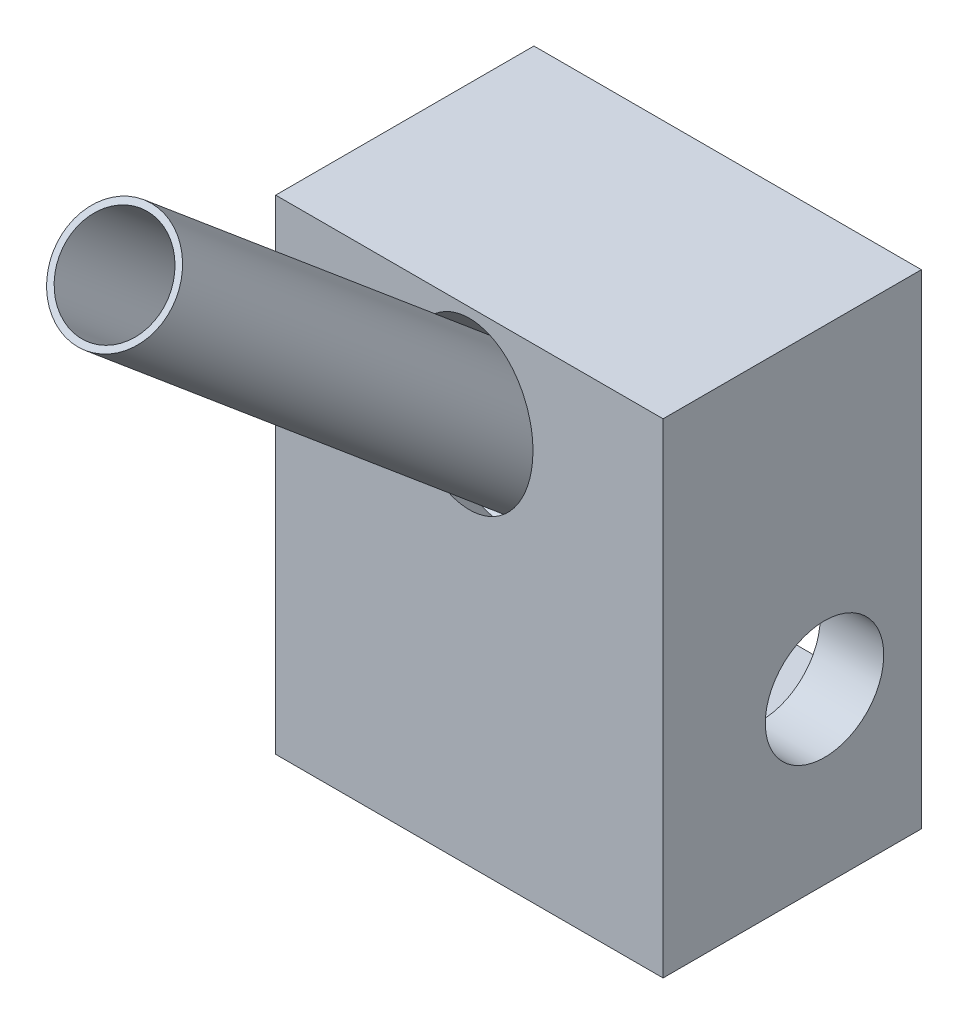
ISO-10303-21;
HEADER;
FILE_DESCRIPTION(('STEP AP214'),'2;1');
FILE_NAME('part.step','',(''),(''),'','','');
FILE_SCHEMA(('AUTOMOTIVE_DESIGN { 1 0 10303 214 1 1 1 1 }'));
ENDSEC;
DATA;
#1=APPLICATION_CONTEXT('core data for automotive mechanical design processes');
#2=APPLICATION_PROTOCOL_DEFINITION('international standard','automotive_design',2000,#1);
#3=PRODUCT_CONTEXT('',#1,'mechanical');
#4=PRODUCT('Part','Part','',(#3));
#5=PRODUCT_RELATED_PRODUCT_CATEGORY('part','',(#4));
#6=PRODUCT_DEFINITION_FORMATION('','',#4);
#7=PRODUCT_DEFINITION_CONTEXT('part definition',#1,'design');
#8=PRODUCT_DEFINITION('design','',#6,#7);
#9=PRODUCT_DEFINITION_SHAPE('','',#8);
#10=(LENGTH_UNIT() NAMED_UNIT(*) SI_UNIT(.MILLI.,.METRE.));
#11=(NAMED_UNIT(*) PLANE_ANGLE_UNIT() SI_UNIT($,.RADIAN.));
#12=(NAMED_UNIT(*) SI_UNIT($,.STERADIAN.) SOLID_ANGLE_UNIT());
#13=UNCERTAINTY_MEASURE_WITH_UNIT(LENGTH_MEASURE(1.E-05),#10,'distance_accuracy_value','');
#14=(GEOMETRIC_REPRESENTATION_CONTEXT(3) GLOBAL_UNCERTAINTY_ASSIGNED_CONTEXT((#13)) GLOBAL_UNIT_ASSIGNED_CONTEXT((#10,
#11,#12)) REPRESENTATION_CONTEXT('',''));
#15=CARTESIAN_POINT('',(0.,0.,0.));
#16=DIRECTION('',(0.,0.,1.));
#17=DIRECTION('',(1.,0.,0.));
#18=AXIS2_PLACEMENT_3D('',#15,#16,#17);
#19=CARTESIAN_POINT('',(6081.53419354839,-5721.3842472929,14.8729976359904));
#20=DIRECTION('',(0.,0.642787609686541,0.766044443118977));
#21=DIRECTION('',(0.,-0.766044443118977,0.642787609686541));
#22=AXIS2_PLACEMENT_3D('',#19,#20,#21);
#23=CYLINDRICAL_SURFACE('',#22,4.50000000000016);
#24=CARTESIAN_POINT('',(6081.53419354839,-5721.3842472929,14.8729976359904));
#25=DIRECTION('',(0.,-0.64278760968654,-0.766044443118977));
#26=DIRECTION('',(0.,0.766044443118977,-0.642787609686541));
#27=AXIS2_PLACEMENT_3D('',#24,#25,#26);
#28=CIRCLE('',#27,4.50000000000016);
#29=CARTESIAN_POINT('',(6078.12066787357,-5723.63044876914,16.757784466254));
#30=VERTEX_POINT('',#29);
#31=CARTESIAN_POINT('',(6084.9477192232,-5723.63044876914,16.757784466254));
#32=VERTEX_POINT('',#31);
#33=EDGE_CURVE('E59',#30,#32,#28,.T.);
#34=ORIENTED_EDGE('',*,*,#33,.F.);
#35=CARTESIAN_POINT('',(6078.12066787357,-5723.63044876914,16.7577844662536));
#36=CARTESIAN_POINT('',(6078.18759995157,-5723.66190703217,16.8416049243904));
#37=CARTESIAN_POINT('',(6078.25825487904,-5723.69480751935,16.9218666338246));
#38=CARTESIAN_POINT('',(6078.40643349452,-5723.76222688249,17.0749009675173));
#39=CARTESIAN_POINT('',(6078.48395156153,-5723.79674442335,17.1476796168));
#40=CARTESIAN_POINT('',(6078.64495517383,-5723.8659999445,17.2851421828047));
#41=CARTESIAN_POINT('',(6078.72840633703,-5723.90073573684,17.3498675784913));
#42=CARTESIAN_POINT('',(6078.90102789082,-5723.96948092325,17.4716365250856));
#43=CARTESIAN_POINT('',(6078.99019915953,-5724.00349020472,17.5286788923679));
#44=CARTESIAN_POINT('',(6079.17334960063,-5724.06966066917,17.6350110552931));
#45=CARTESIAN_POINT('',(6079.26731565184,-5724.10182643296,17.684320647252));
#46=CARTESIAN_POINT('',(6079.45964153633,-5724.16352128125,17.775567146249));
#47=CARTESIAN_POINT('',(6079.55800334487,-5724.19304916216,17.817500696183));
#48=CARTESIAN_POINT('',(6079.75849778646,-5724.24870365027,17.8942309963462));
#49=CARTESIAN_POINT('',(6079.86063345183,-5724.27482744246,17.9290218534492));
#50=CARTESIAN_POINT('',(6080.06794783988,-5724.32300186339,17.9916719181368));
#51=CARTESIAN_POINT('',(6080.17312675741,-5724.34505223064,18.0195306807706));
#52=CARTESIAN_POINT('',(6080.39262006201,-5724.3858086515,18.0700990156142));
#53=CARTESIAN_POINT('',(6080.50709123051,-5724.40421457823,18.0923709061792));
#54=CARTESIAN_POINT('',(6080.73798172819,-5724.43535547192,18.1295711453445));
#55=CARTESIAN_POINT('',(6080.85440112483,-5724.44809024207,18.1444992390832));
#56=CARTESIAN_POINT('',(6081.08845478281,-5724.46757025504,18.167181781007));
#57=CARTESIAN_POINT('',(6081.20608925797,-5724.47431442484,18.1749349440411));
#58=CARTESIAN_POINT('',(6081.44180199103,-5724.48164231975,18.1833540503443));
#59=CARTESIAN_POINT('',(6081.5598802533,-5724.48222598397,18.1840199235536));
#60=CARTESIAN_POINT('',(6081.80207613055,-5724.47708248246,18.1781178727609));
#61=CARTESIAN_POINT('',(6081.92617732621,-5724.47101452009,18.1711593192688));
#62=CARTESIAN_POINT('',(6082.17317106383,-5724.45218601958,18.1492902437184));
#63=CARTESIAN_POINT('',(6082.29606354597,-5724.43942515186,18.1343793300579));
#64=CARTESIAN_POINT('',(6082.53980613348,-5724.40755959732,18.0964090259096));
#65=CARTESIAN_POINT('',(6082.66065535725,-5724.38845224211,18.0733462076593));
#66=CARTESIAN_POINT('',(6082.89936129001,-5724.34444153167,18.0188033856007));
#67=CARTESIAN_POINT('',(6083.0172181088,-5724.31953838943,17.9873236910926));
#68=CARTESIAN_POINT('',(6083.24878856556,-5724.26473294129,17.9156944989322));
#69=CARTESIAN_POINT('',(6083.36251051122,-5724.23484142101,17.8755636528838));
#70=CARTESIAN_POINT('',(6083.58516513278,-5724.17094953481,17.7862425311674));
#71=CARTESIAN_POINT('',(6083.69409729048,-5724.13694872581,17.7370512782435));
#72=CARTESIAN_POINT('',(6083.90600594199,-5724.06604436807,17.6294065540859));
#73=CARTESIAN_POINT('',(6084.00899412283,-5724.02914687735,17.5709721666907));
#74=CARTESIAN_POINT('',(6084.20826345875,-5723.95373696427,17.4446043856915));
#75=CARTESIAN_POINT('',(6084.30454780911,-5723.91522532549,17.3766755645321));
#76=CARTESIAN_POINT('',(6084.49855786136,-5723.83432420157,17.2241949215183));
#77=CARTESIAN_POINT('',(6084.59552130026,-5723.7919201165,17.1386705877237));
#78=CARTESIAN_POINT('',(6084.73337374747,-5723.72983493684,17.0020390590685));
#79=CARTESIAN_POINT('',(6084.77808202694,-5723.70938233698,16.9550757247509));
#80=CARTESIAN_POINT('',(6084.86488564371,-5723.66925849088,16.8584390857653));
#81=CARTESIAN_POINT('',(6084.90697990303,-5723.64958756818,16.8087646787462));
#82=CARTESIAN_POINT('',(6084.9477192232,-5723.63044876914,16.7577844662536));
#83=B_SPLINE_CURVE_WITH_KNOTS('',3,(#35,#36,#37,#38,#39,#40,#41,#42,#43,#44,#45,#46,#47,#48,#49,
#50,#51,#52,#53,#54,#55,#56,#57,#58,#59,#60,#61,#62,#63,#64,#65,#66,#67,#68,#69,#70,#71,#72,#73,
#74,#75,#76,#77,#78,#79,#80,#81,#82),.UNSPECIFIED.,.F.,.F.,(4,2,2,2,2,2,2,2,2,2,2,2,2,2,2,2,2,2,
2,2,2,2,2,4),(0.,0.335175602592563,0.670079188024965,1.00317935057087,1.33633077102502,
1.66861487013869,2.00104981465719,2.33375794425292,2.66648742389459,3.02028293219794,
3.37409071787262,3.72796186422608,4.08183650869123,4.45472654523387,4.82763494589437,
5.20070033625395,5.57375201923184,5.94600731810066,6.31830279197171,6.68983940473666,
7.0611977009893,7.46849437503804,7.67237127910249,7.87633170841938),.UNSPECIFIED.);
#84=EDGE_CURVE('E70',#30,#32,#83,.T.);
#85=ORIENTED_EDGE('',*,*,#84,.T.);
#86=EDGE_LOOP('',(#34,#85));
#87=FACE_BOUND('',#86,.T.);
#88=CARTESIAN_POINT('',(6081.53419354839,-5687.09795619222,55.7338082319567));
#89=DIRECTION('',(0.,-0.64278760968654,-0.766044443118977));
#90=DIRECTION('',(0.,0.766044443118977,-0.642787609686541));
#91=AXIS2_PLACEMENT_3D('',#88,#89,#90);
#92=CIRCLE('',#91,4.50000000000016);
#93=CARTESIAN_POINT('',(6081.53419354839,-5683.65075619818,52.8412639883671));
#94=VERTEX_POINT('',#93);
#95=EDGE_CURVE('E91',#94,#94,#92,.T.);
#96=ORIENTED_EDGE('',*,*,#95,.T.);
#97=EDGE_LOOP('',(#96));
#98=FACE_BOUND('',#97,.T.);
#99=ADVANCED_FACE('F45',(#87,#98),#23,.T.);
#100=CARTESIAN_POINT('',(6081.53419354839,-5721.3842472929,14.8729976359904));
#101=DIRECTION('',(0.,-0.64278760968654,-0.766044443118977));
#102=DIRECTION('',(0.,0.766044443118977,-0.642787609686541));
#103=AXIS2_PLACEMENT_3D('',#100,#101,#102);
#104=PLANE('',#103);
#105=DIRECTION('',(1.,0.,0.));
#106=VECTOR('',#105,1.);
#107=CARTESIAN_POINT('',(6066.29419354839,-5723.63044876914,16.7577844662541));
#108=LINE('',#107,#106);
#109=CARTESIAN_POINT('',(6078.81350291316,-5723.63044876914,16.757784466253));
#110=VERTEX_POINT('',#109);
#111=EDGE_CURVE('E66',#30,#110,#108,.T.);
#112=ORIENTED_EDGE('',*,*,#111,.F.);
#113=ORIENTED_EDGE('',*,*,#33,.T.);
#114=CARTESIAN_POINT('',(6084.25488418361,-5723.63044876914,16.757784466253));
#115=VERTEX_POINT('',#114);
#116=EDGE_CURVE('E76',#115,#32,#108,.T.);
#117=ORIENTED_EDGE('',*,*,#116,.F.);
#118=CARTESIAN_POINT('',(6081.53419354839,-5721.3842472929,14.8729976359898));
#119=DIRECTION('',(0.,-0.642787609686541,-0.766044443118977));
#120=DIRECTION('',(0.,0.766044443118977,-0.642787609686541));
#121=AXIS2_PLACEMENT_3D('',#118,#119,#120);
#122=CIRCLE('',#121,3.99999999999942);
#123=EDGE_CURVE('E83',#110,#115,#122,.T.);
#124=ORIENTED_EDGE('',*,*,#123,.F.);
#125=EDGE_LOOP('',(#112,#113,#117,#124));
#126=FACE_BOUND('',#125,.T.);
#127=ADVANCED_FACE('F82',(#126),#104,.T.);
#128=CARTESIAN_POINT('',(6081.53419354839,-5687.09795619222,55.7338082319567));
#129=DIRECTION('',(0.,-0.64278760968654,-0.766044443118977));
#130=DIRECTION('',(0.,0.766044443118977,-0.642787609686541));
#131=AXIS2_PLACEMENT_3D('',#128,#129,#130);
#132=PLANE('',#131);
#133=CARTESIAN_POINT('',(6081.53419354839,-5687.09795619222,55.7338082319567));
#134=DIRECTION('',(0.,-0.64278760968654,-0.766044443118977));
#135=DIRECTION('',(0.,0.766044443118977,-0.642787609686541));
#136=AXIS2_PLACEMENT_3D('',#133,#134,#135);
#137=CIRCLE('',#136,3.99999999999942);
#138=CARTESIAN_POINT('',(6081.53419354839,-5684.03377841974,53.1626577932109));
#139=VERTEX_POINT('',#138);
#140=EDGE_CURVE('E88',#139,#139,#137,.T.);
#141=ORIENTED_EDGE('',*,*,#140,.T.);
#142=EDGE_LOOP('',(#141));
#143=FACE_BOUND('',#142,.T.);
#144=ORIENTED_EDGE('',*,*,#95,.F.);
#145=EDGE_LOOP('',(#144));
#146=FACE_BOUND('',#145,.T.);
#147=ADVANCED_FACE('F103',(#143,#146),#132,.F.);
#148=CARTESIAN_POINT('',(6081.53419354839,-5684.2493561952,59.1286375122663));
#149=DIRECTION('',(0.,-0.642787609686541,-0.766044443118977));
#150=DIRECTION('',(0.,0.766044443118977,-0.642787609686541));
#151=AXIS2_PLACEMENT_3D('',#148,#149,#150);
#152=CYLINDRICAL_SURFACE('',#151,3.99999999999942);
#153=ORIENTED_EDGE('',*,*,#123,.T.);
#154=CARTESIAN_POINT('',(6084.25488418361,-5723.63044876914,16.757784466253));
#155=CARTESIAN_POINT('',(6084.18537131392,-5723.6564923768,16.82715477355));
#156=CARTESIAN_POINT('',(6084.11269152254,-5723.68313631424,16.8930907309273));
#157=CARTESIAN_POINT('',(6083.96161562347,-5723.73661218394,17.0178671362293));
#158=CARTESIAN_POINT('',(6083.88322298149,-5723.76344399345,17.0767118295209));
#159=CARTESIAN_POINT('',(6083.72156858032,-5723.81621395044,17.1869482255406));
#160=CARTESIAN_POINT('',(6083.63832692589,-5723.84215516544,17.238368001421));
#161=CARTESIAN_POINT('',(6083.46732868406,-5723.8923792751,17.3340192134597));
#162=CARTESIAN_POINT('',(6083.37957159549,-5723.91666198498,17.3782498494287));
#163=CARTESIAN_POINT('',(6083.2003633395,-5723.96275433485,17.4595115989849));
#164=CARTESIAN_POINT('',(6083.10891894325,-5723.98456825089,17.4965552428024));
#165=CARTESIAN_POINT('',(6082.9228125278,-5724.02513241029,17.5636750508639));
#166=CARTESIAN_POINT('',(6082.82814930571,-5724.04388149278,17.593748576831));
#167=CARTESIAN_POINT('',(6082.63623408812,-5724.07778752065,17.6470664263317));
#168=CARTESIAN_POINT('',(6082.53898066852,-5724.09294244264,17.6703069048496));
#169=CARTESIAN_POINT('',(6082.34257560509,-5724.11923836203,17.7100716568245));
#170=CARTESIAN_POINT('',(6082.24342388301,-5724.13037919357,17.7265956527478));
#171=CARTESIAN_POINT('',(6082.03947721029,-5724.14874921996,17.7536158559206));
#172=CARTESIAN_POINT('',(6081.93462550671,-5724.15578538531,17.7638158459218));
#173=CARTESIAN_POINT('',(6081.72430362775,-5724.16496697284,17.7770916390182));
#174=CARTESIAN_POINT('',(6081.61883371914,-5724.16711436833,17.7801703165877));
#175=CARTESIAN_POINT('',(6081.40787343374,-5724.1664652282,17.7792366004342));
#176=CARTESIAN_POINT('',(6081.3023830859,-5724.16366557767,17.7752197390018));
#177=CARTESIAN_POINT('',(6081.09219535857,-5724.15319535929,17.760056621233));
#178=CARTESIAN_POINT('',(6080.98749772226,-5724.14552644386,17.7489127834713));
#179=CARTESIAN_POINT('',(6080.77665641165,-5724.12525214029,17.718998206889));
#180=CARTESIAN_POINT('',(6080.67055440122,-5724.11251447197,17.700022540719));
#181=CARTESIAN_POINT('',(6080.46067197686,-5724.0825001111,17.6543025431089));
#182=CARTESIAN_POINT('',(6080.35689191864,-5724.06522272824,17.6275570301108));
#183=CARTESIAN_POINT('',(6080.15255013618,-5724.02668798064,17.5661525258179));
#184=CARTESIAN_POINT('',(6080.05198587956,-5724.00543384267,17.531499945388));
#185=CARTESIAN_POINT('',(6079.85484090244,-5723.95964611486,17.4541148925196));
#186=CARTESIAN_POINT('',(6079.75825810143,-5723.93511426695,17.4113867068826));
#187=CARTESIAN_POINT('',(6079.58543835907,-5723.88788823897,17.3254700261692));
#188=CARTESIAN_POINT('',(6079.5084790391,-5723.86556155238,17.2835273368002));
#189=CARTESIAN_POINT('',(6079.35833792209,-5723.81980499973,17.1939010484206));
#190=CARTESIAN_POINT('',(6079.28515532983,-5723.79637536791,17.1462186650436));
#191=CARTESIAN_POINT('',(6079.14283706018,-5723.74899896127,17.0450218491613));
#192=CARTESIAN_POINT('',(6079.07371117541,-5723.72505111187,16.9914941303019));
#193=CARTESIAN_POINT('',(6078.94005101403,-5723.67739111506,16.8788158813642));
#194=CARTESIAN_POINT('',(6078.87551927857,-5723.65367910424,16.8196622810553));
#195=CARTESIAN_POINT('',(6078.81350291316,-5723.63044876914,16.7577844662534));
#196=B_SPLINE_CURVE_WITH_KNOTS('',3,(#154,#155,#156,#157,#158,#159,#160,#161,#162,#163,#164,
#165,#166,#167,#168,#169,#170,#171,#172,#173,#174,#175,#176,#177,#178,#179,#180,#181,#182,#183,
#184,#185,#186,#187,#188,#189,#190,#191,#192,#193,#194,#195),.UNSPECIFIED.,.F.,.F.,(4,2,2,2,2,2,
2,2,2,2,2,2,2,2,2,2,2,2,2,2,4),(0.,0.304658381152786,0.609133454978497,0.912425362848339,
1.21575100563264,1.51854296409983,1.82144934661267,2.12452585241071,2.42761488045125,
2.74399946993367,3.0602563304082,3.37671239314794,3.69306112190065,4.01827262450265,
4.34353360781443,4.66853180832674,4.99335797101536,5.26444122526303,5.53546716634635,
5.80712249847138,6.07892694206509),.UNSPECIFIED.);
#197=EDGE_CURVE('E12',#115,#110,#196,.T.);
#198=ORIENTED_EDGE('',*,*,#197,.T.);
#199=EDGE_LOOP('',(#153,#198));
#200=FACE_BOUND('',#199,.T.);
#201=ORIENTED_EDGE('',*,*,#140,.F.);
#202=EDGE_LOOP('',(#201));
#203=FACE_BOUND('',#202,.T.);
#204=ADVANCED_FACE('F86',(#200,#203),#152,.F.);
#205=CARTESIAN_POINT('',(6066.29419354839,-5727.99273505216,15.12));
#206=DIRECTION('',(1.,0.,0.));
#207=DIRECTION('',(0.,1.,0.));
#208=AXIS2_PLACEMENT_3D('',#205,#206,#207);
#209=CYLINDRICAL_SURFACE('',#208,4.65960079544898);
#210=ORIENTED_EDGE('',*,*,#111,.T.);
#211=ORIENTED_EDGE('',*,*,#197,.F.);
#212=ORIENTED_EDGE('',*,*,#116,.T.);
#213=ORIENTED_EDGE('',*,*,#84,.F.);
#214=EDGE_LOOP('',(#210,#211,#212,#213));
#215=FACE_BOUND('',#214,.T.);
#216=ADVANCED_FACE('F75',(#215),#209,.F.);
#217=CLOSED_SHELL('',(#99,#127,#147,#204,#216));
#218=MANIFOLD_SOLID_BREP('B2',#217);
#219=CARTESIAN_POINT('',(6066.29419354839,-5703.22580645161,27.82));
#220=DIRECTION('',(1.,0.,0.));
#221=DIRECTION('',(0.,0.,-1.));
#222=AXIS2_PLACEMENT_3D('',#219,#220,#221);
#223=PLANE('',#222);
#224=CARTESIAN_POINT('',(6066.29419354839,-5727.99273505216,15.12));
#225=DIRECTION('',(1.,0.,0.));
#226=DIRECTION('',(0.,1.,0.));
#227=AXIS2_PLACEMENT_3D('',#224,#225,#226);
#228=CIRCLE('',#227,4.65960079544898);
#229=CARTESIAN_POINT('',(6066.29419354839,-5723.33313425671,15.12));
#230=VERTEX_POINT('',#229);
#231=EDGE_CURVE('E364',#230,#230,#228,.T.);
#232=ORIENTED_EDGE('',*,*,#231,.T.);
#233=EDGE_LOOP('',(#232));
#234=FACE_BOUND('',#233,.T.);
#235=DIRECTION('',(0.,-1.,0.));
#236=VECTOR('',#235,1.);
#237=CARTESIAN_POINT('',(6066.29419354839,-5703.22580645161,7.5));
#238=LINE('',#237,#236);
#239=CARTESIAN_POINT('',(6066.29419354839,-5703.22580645161,7.5));
#240=VERTEX_POINT('',#239);
#241=CARTESIAN_POINT('',(6066.29419354839,-5741.32580645161,7.5));
#242=VERTEX_POINT('',#241);
#243=EDGE_CURVE('E291',#240,#242,#238,.T.);
#244=ORIENTED_EDGE('',*,*,#243,.T.);
#245=DIRECTION('',(0.,0.,-1.));
#246=VECTOR('',#245,1.);
#247=CARTESIAN_POINT('',(6066.29419354839,-5741.32580645161,27.82));
#248=LINE('',#247,#246);
#249=CARTESIAN_POINT('',(6066.29419354839,-5741.32580645161,27.82));
#250=VERTEX_POINT('',#249);
#251=EDGE_CURVE('E157',#250,#242,#248,.T.);
#252=ORIENTED_EDGE('',*,*,#251,.F.);
#253=DIRECTION('',(0.,-1.,0.));
#254=VECTOR('',#253,1.);
#255=CARTESIAN_POINT('',(6066.29419354839,-5703.22580645161,27.82));
#256=LINE('',#255,#254);
#257=CARTESIAN_POINT('',(6066.29419354839,-5703.22580645161,27.82));
#258=VERTEX_POINT('',#257);
#259=EDGE_CURVE('E297',#258,#250,#256,.T.);
#260=ORIENTED_EDGE('',*,*,#259,.F.);
#261=DIRECTION('',(0.,0.,-1.));
#262=VECTOR('',#261,1.);
#263=CARTESIAN_POINT('',(6066.29419354839,-5703.22580645161,27.82));
#264=LINE('',#263,#262);
#265=EDGE_CURVE('E307',#258,#240,#264,.T.);
#266=ORIENTED_EDGE('',*,*,#265,.T.);
#267=EDGE_LOOP('',(#244,#252,#260,#266));
#268=FACE_BOUND('',#267,.T.);
#269=ADVANCED_FACE('F149',(#234,#268),#223,.F.);
#270=CARTESIAN_POINT('',(6066.29419354839,-5741.32580645161,27.82));
#271=DIRECTION('',(0.,1.,0.));
#272=DIRECTION('',(0.,0.,1.));
#273=AXIS2_PLACEMENT_3D('',#270,#271,#272);
#274=PLANE('',#273);
#275=DIRECTION('',(1.,0.,0.));
#276=VECTOR('',#275,1.);
#277=CARTESIAN_POINT('',(6066.29419354839,-5741.32580645161,7.5));
#278=LINE('',#277,#276);
#279=CARTESIAN_POINT('',(6096.77419354839,-5741.32580645161,7.5));
#280=VERTEX_POINT('',#279);
#281=EDGE_CURVE('E310',#242,#280,#278,.T.);
#282=ORIENTED_EDGE('',*,*,#281,.T.);
#283=DIRECTION('',(0.,0.,-1.));
#284=VECTOR('',#283,1.);
#285=CARTESIAN_POINT('',(6096.77419354839,-5741.32580645161,27.82));
#286=LINE('',#285,#284);
#287=CARTESIAN_POINT('',(6096.77419354839,-5741.32580645161,27.82));
#288=VERTEX_POINT('',#287);
#289=EDGE_CURVE('E320',#288,#280,#286,.T.);
#290=ORIENTED_EDGE('',*,*,#289,.F.);
#291=DIRECTION('',(1.,0.,0.));
#292=VECTOR('',#291,1.);
#293=CARTESIAN_POINT('',(6066.29419354839,-5741.32580645161,27.82));
#294=LINE('',#293,#292);
#295=EDGE_CURVE('E300',#250,#288,#294,.T.);
#296=ORIENTED_EDGE('',*,*,#295,.F.);
#297=ORIENTED_EDGE('',*,*,#251,.T.);
#298=EDGE_LOOP('',(#282,#290,#296,#297));
#299=FACE_BOUND('',#298,.T.);
#300=ADVANCED_FACE('F326',(#299),#274,.F.);
#301=CARTESIAN_POINT('',(6096.77419354839,-5703.22580645161,27.82));
#302=DIRECTION('',(-1.,0.,0.));
#303=DIRECTION('',(0.,-1.,0.));
#304=AXIS2_PLACEMENT_3D('',#301,#302,#303);
#305=PLANE('',#304);
#306=CARTESIAN_POINT('',(6096.77419354842,-5727.99273505216,15.12));
#307=DIRECTION('',(1.,0.,0.));
#308=DIRECTION('',(0.,1.,0.));
#309=AXIS2_PLACEMENT_3D('',#306,#307,#308);
#310=CIRCLE('',#309,4.65960079544898);
#311=CARTESIAN_POINT('',(6096.77419354842,-5723.33313425671,15.12));
#312=VERTEX_POINT('',#311);
#313=EDGE_CURVE('E366',#312,#312,#310,.T.);
#314=ORIENTED_EDGE('',*,*,#313,.F.);
#315=EDGE_LOOP('',(#314));
#316=FACE_BOUND('',#315,.T.);
#317=DIRECTION('',(0.,1.,0.));
#318=VECTOR('',#317,1.);
#319=CARTESIAN_POINT('',(6096.77419354839,-5703.22580645161,7.5));
#320=LINE('',#319,#318);
#321=CARTESIAN_POINT('',(6096.77419354839,-5703.22580645161,7.5));
#322=VERTEX_POINT('',#321);
#323=EDGE_CURVE('E312',#280,#322,#320,.T.);
#324=ORIENTED_EDGE('',*,*,#323,.T.);
#325=DIRECTION('',(0.,0.,-1.));
#326=VECTOR('',#325,1.);
#327=CARTESIAN_POINT('',(6096.77419354839,-5703.22580645161,27.82));
#328=LINE('',#327,#326);
#329=CARTESIAN_POINT('',(6096.77419354839,-5703.22580645161,27.82));
#330=VERTEX_POINT('',#329);
#331=EDGE_CURVE('E317',#330,#322,#328,.T.);
#332=ORIENTED_EDGE('',*,*,#331,.F.);
#333=DIRECTION('',(0.,1.,0.));
#334=VECTOR('',#333,1.);
#335=CARTESIAN_POINT('',(6096.77419354839,-5703.22580645161,27.82));
#336=LINE('',#335,#334);
#337=EDGE_CURVE('E303',#288,#330,#336,.T.);
#338=ORIENTED_EDGE('',*,*,#337,.F.);
#339=ORIENTED_EDGE('',*,*,#289,.T.);
#340=EDGE_LOOP('',(#324,#332,#338,#339));
#341=FACE_BOUND('',#340,.T.);
#342=ADVANCED_FACE('F338',(#316,#341),#305,.F.);
#343=CARTESIAN_POINT('',(6066.29419354839,-5703.22580645161,27.82));
#344=DIRECTION('',(0.,-1.,0.));
#345=DIRECTION('',(0.,0.,-1.));
#346=AXIS2_PLACEMENT_3D('',#343,#344,#345);
#347=PLANE('',#346);
#348=DIRECTION('',(-1.,0.,0.));
#349=VECTOR('',#348,1.);
#350=CARTESIAN_POINT('',(6066.29419354839,-5703.22580645161,7.5));
#351=LINE('',#350,#349);
#352=EDGE_CURVE('E301',#322,#240,#351,.T.);
#353=ORIENTED_EDGE('',*,*,#352,.T.);
#354=ORIENTED_EDGE('',*,*,#265,.F.);
#355=DIRECTION('',(-1.,0.,0.));
#356=VECTOR('',#355,1.);
#357=CARTESIAN_POINT('',(6066.29419354839,-5703.22580645161,27.82));
#358=LINE('',#357,#356);
#359=EDGE_CURVE('E305',#330,#258,#358,.T.);
#360=ORIENTED_EDGE('',*,*,#359,.F.);
#361=ORIENTED_EDGE('',*,*,#331,.T.);
#362=EDGE_LOOP('',(#353,#354,#360,#361));
#363=FACE_BOUND('',#362,.T.);
#364=ADVANCED_FACE('F342',(#363),#347,.F.);
#365=CARTESIAN_POINT('',(0.,0.,27.82));
#366=DIRECTION('',(0.,0.,1.));
#367=DIRECTION('',(1.,0.,0.));
#368=AXIS2_PLACEMENT_3D('',#365,#366,#367);
#369=PLANE('',#368);
#370=CARTESIAN_POINT('',(6081.53419354839,-5710.5204223844,27.82));
#371=DIRECTION('',(0.,0.,1.));
#372=DIRECTION('',(0.,1.,0.));
#373=AXIS2_PLACEMENT_3D('',#370,#371,#372);
#374=ELLIPSE('',#373,6.52703644666172,5.00000000000024);
#375=CARTESIAN_POINT('',(6081.53419354839,-5703.99338593774,27.82));
#376=VERTEX_POINT('',#375);
#377=EDGE_CURVE('E262',#376,#376,#374,.F.);
#378=ORIENTED_EDGE('',*,*,#377,.T.);
#379=EDGE_LOOP('',(#378));
#380=FACE_BOUND('',#379,.T.);
#381=ORIENTED_EDGE('',*,*,#259,.T.);
#382=ORIENTED_EDGE('',*,*,#295,.T.);
#383=ORIENTED_EDGE('',*,*,#337,.T.);
#384=ORIENTED_EDGE('',*,*,#359,.T.);
#385=EDGE_LOOP('',(#381,#382,#383,#384));
#386=FACE_BOUND('',#385,.T.);
#387=ADVANCED_FACE('F344',(#380,#386),#369,.T.);
#388=CARTESIAN_POINT('',(0.,0.,7.5));
#389=DIRECTION('',(0.,0.,1.));
#390=DIRECTION('',(1.,0.,0.));
#391=AXIS2_PLACEMENT_3D('',#388,#389,#390);
#392=PLANE('',#391);
#393=CARTESIAN_POINT('',(6071.75061584616,-5737.38177139835,7.5));
#394=DIRECTION('',(0.,0.,-1.));
#395=DIRECTION('',(-1.,0.,0.));
#396=AXIS2_PLACEMENT_3D('',#393,#394,#395);
#397=CIRCLE('',#396,3.14999999999976);
#398=CARTESIAN_POINT('',(6068.60061584616,-5737.38177139835,7.5));
#399=VERTEX_POINT('',#398);
#400=EDGE_CURVE('E243',#399,#399,#397,.T.);
#401=ORIENTED_EDGE('',*,*,#400,.F.);
#402=EDGE_LOOP('',(#401));
#403=FACE_BOUND('',#402,.T.);
#404=CARTESIAN_POINT('',(6091.77419354839,-5737.40099413777,7.5));
#405=DIRECTION('',(0.,0.,-1.));
#406=DIRECTION('',(-1.,0.,0.));
#407=AXIS2_PLACEMENT_3D('',#404,#405,#406);
#408=CIRCLE('',#407,3.14999999999976);
#409=CARTESIAN_POINT('',(6088.62419354839,-5737.40099413777,7.5));
#410=VERTEX_POINT('',#409);
#411=EDGE_CURVE('E236',#410,#410,#408,.T.);
#412=ORIENTED_EDGE('',*,*,#411,.F.);
#413=EDGE_LOOP('',(#412));
#414=FACE_BOUND('',#413,.T.);
#415=CARTESIAN_POINT('',(6091.77756250093,-5707.15062030121,7.5));
#416=DIRECTION('',(0.,0.,-1.));
#417=DIRECTION('',(-1.,0.,0.));
#418=AXIS2_PLACEMENT_3D('',#415,#416,#417);
#419=CIRCLE('',#418,3.14999999999976);
#420=CARTESIAN_POINT('',(6088.62756250093,-5707.15062030121,7.5));
#421=VERTEX_POINT('',#420);
#422=EDGE_CURVE('E252',#421,#421,#419,.T.);
#423=ORIENTED_EDGE('',*,*,#422,.F.);
#424=EDGE_LOOP('',(#423));
#425=FACE_BOUND('',#424,.T.);
#426=DIRECTION('',(-1.,0.,0.));
#427=VECTOR('',#426,1.);
#428=CARTESIAN_POINT('',(6091.77419354839,-5733.70580645161,7.5));
#429=LINE('',#428,#427);
#430=CARTESIAN_POINT('',(6091.77419354839,-5733.70580645161,7.5));
#431=VERTEX_POINT('',#430);
#432=CARTESIAN_POINT('',(6071.37419354839,-5733.70580645161,7.5));
#433=VERTEX_POINT('',#432);
#434=EDGE_CURVE('E281',#431,#433,#429,.T.);
#435=ORIENTED_EDGE('',*,*,#434,.F.);
#436=DIRECTION('',(0.,-1.,0.));
#437=VECTOR('',#436,1.);
#438=CARTESIAN_POINT('',(6091.77419354839,-5710.84580645161,7.5));
#439=LINE('',#438,#437);
#440=CARTESIAN_POINT('',(6091.77419354839,-5710.84580645161,7.5));
#441=VERTEX_POINT('',#440);
#442=EDGE_CURVE('E170',#441,#431,#439,.T.);
#443=ORIENTED_EDGE('',*,*,#442,.F.);
#444=DIRECTION('',(1.,0.,0.));
#445=VECTOR('',#444,1.);
#446=CARTESIAN_POINT('',(6091.77419354839,-5710.84580645161,7.5));
#447=LINE('',#446,#445);
#448=CARTESIAN_POINT('',(6071.37419354839,-5710.84580645161,7.5));
#449=VERTEX_POINT('',#448);
#450=EDGE_CURVE('E269',#449,#441,#447,.T.);
#451=ORIENTED_EDGE('',*,*,#450,.F.);
#452=DIRECTION('',(0.,1.,0.));
#453=VECTOR('',#452,1.);
#454=CARTESIAN_POINT('',(6071.37419354839,-5710.84580645161,7.5));
#455=LINE('',#454,#453);
#456=EDGE_CURVE('E284',#433,#449,#455,.T.);
#457=ORIENTED_EDGE('',*,*,#456,.F.);
#458=EDGE_LOOP('',(#435,#443,#451,#457));
#459=FACE_BOUND('',#458,.T.);
#460=ORIENTED_EDGE('',*,*,#243,.F.);
#461=ORIENTED_EDGE('',*,*,#352,.F.);
#462=ORIENTED_EDGE('',*,*,#323,.F.);
#463=ORIENTED_EDGE('',*,*,#281,.F.);
#464=EDGE_LOOP('',(#460,#461,#462,#463));
#465=FACE_BOUND('',#464,.T.);
#466=ADVANCED_FACE('F334',(#403,#414,#425,#459,#465),#392,.F.);
#467=CARTESIAN_POINT('',(6091.77419354839,-5710.84580645161,25.28));
#468=DIRECTION('',(1.,0.,0.));
#469=DIRECTION('',(0.,0.,-1.));
#470=AXIS2_PLACEMENT_3D('',#467,#468,#469);
#471=PLANE('',#470);
#472=CARTESIAN_POINT('',(6091.77419354839,-5727.99273505216,15.12));
#473=DIRECTION('',(1.,0.,0.));
#474=DIRECTION('',(0.,0.,-1.));
#475=AXIS2_PLACEMENT_3D('',#472,#473,#474);
#476=CIRCLE('',#475,4.65960079544898);
#477=CARTESIAN_POINT('',(6091.77419354839,-5727.99273505216,10.460399204551));
#478=VERTEX_POINT('',#477);
#479=EDGE_CURVE('E369',#478,#478,#476,.T.);
#480=ORIENTED_EDGE('',*,*,#479,.T.);
#481=EDGE_LOOP('',(#480));
#482=FACE_BOUND('',#481,.T.);
#483=ORIENTED_EDGE('',*,*,#442,.T.);
#484=DIRECTION('',(0.,0.,-1.));
#485=VECTOR('',#484,1.);
#486=CARTESIAN_POINT('',(6091.77419354839,-5733.70580645161,25.28));
#487=LINE('',#486,#485);
#488=CARTESIAN_POINT('',(6091.77419354839,-5733.70580645161,25.28));
#489=VERTEX_POINT('',#488);
#490=EDGE_CURVE('E279',#489,#431,#487,.T.);
#491=ORIENTED_EDGE('',*,*,#490,.F.);
#492=DIRECTION('',(0.,-1.,0.));
#493=VECTOR('',#492,1.);
#494=CARTESIAN_POINT('',(6091.77419354839,-5710.84580645161,25.28));
#495=LINE('',#494,#493);
#496=CARTESIAN_POINT('',(6091.77419354839,-5710.84580645161,25.28));
#497=VERTEX_POINT('',#496);
#498=EDGE_CURVE('E265',#497,#489,#495,.T.);
#499=ORIENTED_EDGE('',*,*,#498,.F.);
#500=DIRECTION('',(0.,0.,-1.));
#501=VECTOR('',#500,1.);
#502=CARTESIAN_POINT('',(6091.77419354839,-5710.84580645161,25.28));
#503=LINE('',#502,#501);
#504=EDGE_CURVE('E289',#497,#441,#503,.T.);
#505=ORIENTED_EDGE('',*,*,#504,.T.);
#506=EDGE_LOOP('',(#483,#491,#499,#505));
#507=FACE_BOUND('',#506,.T.);
#508=ADVANCED_FACE('F352',(#482,#507),#471,.F.);
#509=CARTESIAN_POINT('',(6091.77419354839,-5710.84580645161,25.28));
#510=DIRECTION('',(0.,1.,0.));
#511=DIRECTION('',(0.,0.,1.));
#512=AXIS2_PLACEMENT_3D('',#509,#510,#511);
#513=PLANE('',#512);
#514=CARTESIAN_POINT('',(6081.53419354839,-5710.84580645161,27.4322223689311));
#515=DIRECTION('',(0.,1.,0.));
#516=DIRECTION('',(0.,0.,1.));
#517=AXIS2_PLACEMENT_3D('',#514,#515,#516);
#518=ELLIPSE('',#517,7.77861913430243,5.00000000000024);
#519=CARTESIAN_POINT('',(6076.7293892939,-5710.84580645161,25.28));
#520=VERTEX_POINT('',#519);
#521=CARTESIAN_POINT('',(6086.33899780288,-5710.84580645161,25.28));
#522=VERTEX_POINT('',#521);
#523=EDGE_CURVE('E163',#520,#522,#518,.F.);
#524=ORIENTED_EDGE('',*,*,#523,.F.);
#525=DIRECTION('',(1.,0.,0.));
#526=VECTOR('',#525,1.);
#527=CARTESIAN_POINT('',(6091.77419354839,-5710.84580645161,25.28));
#528=LINE('',#527,#526);
#529=CARTESIAN_POINT('',(6071.37419354839,-5710.84580645161,25.28));
#530=VERTEX_POINT('',#529);
#531=EDGE_CURVE('E276',#530,#520,#528,.T.);
#532=ORIENTED_EDGE('',*,*,#531,.F.);
#533=DIRECTION('',(0.,0.,-1.));
#534=VECTOR('',#533,1.);
#535=CARTESIAN_POINT('',(6071.37419354839,-5710.84580645161,25.28));
#536=LINE('',#535,#534);
#537=EDGE_CURVE('E292',#530,#449,#536,.T.);
#538=ORIENTED_EDGE('',*,*,#537,.T.);
#539=ORIENTED_EDGE('',*,*,#450,.T.);
#540=ORIENTED_EDGE('',*,*,#504,.F.);
#541=EDGE_CURVE('E275',#522,#497,#528,.T.);
#542=ORIENTED_EDGE('',*,*,#541,.F.);
#543=EDGE_LOOP('',(#524,#532,#538,#539,#540,#542));
#544=FACE_BOUND('',#543,.T.);
#545=ADVANCED_FACE('F396',(#544),#513,.F.);
#546=CARTESIAN_POINT('',(6071.37419354839,-5710.84580645161,25.28));
#547=DIRECTION('',(-1.,0.,0.));
#548=DIRECTION('',(0.,0.,1.));
#549=AXIS2_PLACEMENT_3D('',#546,#547,#548);
#550=PLANE('',#549);
#551=CARTESIAN_POINT('',(6071.37419354839,-5727.99273505216,15.12));
#552=DIRECTION('',(-1.,0.,0.));
#553=DIRECTION('',(0.,0.,1.));
#554=AXIS2_PLACEMENT_3D('',#551,#552,#553);
#555=CIRCLE('',#554,4.65960079544898);
#556=CARTESIAN_POINT('',(6071.37419354839,-5727.99273505216,19.779600795449));
#557=VERTEX_POINT('',#556);
#558=EDGE_CURVE('E152',#557,#557,#555,.T.);
#559=ORIENTED_EDGE('',*,*,#558,.T.);
#560=EDGE_LOOP('',(#559));
#561=FACE_BOUND('',#560,.T.);
#562=ORIENTED_EDGE('',*,*,#456,.T.);
#563=ORIENTED_EDGE('',*,*,#537,.F.);
#564=DIRECTION('',(0.,1.,0.));
#565=VECTOR('',#564,1.);
#566=CARTESIAN_POINT('',(6071.37419354839,-5710.84580645161,25.28));
#567=LINE('',#566,#565);
#568=CARTESIAN_POINT('',(6071.37419354839,-5733.70580645161,25.28));
#569=VERTEX_POINT('',#568);
#570=EDGE_CURVE('E272',#569,#530,#567,.T.);
#571=ORIENTED_EDGE('',*,*,#570,.F.);
#572=DIRECTION('',(0.,0.,-1.));
#573=VECTOR('',#572,1.);
#574=CARTESIAN_POINT('',(6071.37419354839,-5733.70580645161,25.28));
#575=LINE('',#574,#573);
#576=EDGE_CURVE('E294',#569,#433,#575,.T.);
#577=ORIENTED_EDGE('',*,*,#576,.T.);
#578=EDGE_LOOP('',(#562,#563,#571,#577));
#579=FACE_BOUND('',#578,.T.);
#580=ADVANCED_FACE('F399',(#561,#579),#550,.F.);
#581=CARTESIAN_POINT('',(6091.77419354839,-5733.70580645161,25.28));
#582=DIRECTION('',(0.,-1.,0.));
#583=DIRECTION('',(0.,0.,-1.));
#584=AXIS2_PLACEMENT_3D('',#581,#582,#583);
#585=PLANE('',#584);
#586=ORIENTED_EDGE('',*,*,#434,.T.);
#587=ORIENTED_EDGE('',*,*,#576,.F.);
#588=DIRECTION('',(-1.,0.,0.));
#589=VECTOR('',#588,1.);
#590=CARTESIAN_POINT('',(6091.77419354839,-5733.70580645161,25.28));
#591=LINE('',#590,#589);
#592=EDGE_CURVE('E268',#489,#569,#591,.T.);
#593=ORIENTED_EDGE('',*,*,#592,.F.);
#594=ORIENTED_EDGE('',*,*,#490,.T.);
#595=EDGE_LOOP('',(#586,#587,#593,#594));
#596=FACE_BOUND('',#595,.T.);
#597=ADVANCED_FACE('F387',(#596),#585,.F.);
#598=CARTESIAN_POINT('',(0.,0.,25.28));
#599=DIRECTION('',(0.,0.,-1.));
#600=DIRECTION('',(-1.,0.,0.));
#601=AXIS2_PLACEMENT_3D('',#598,#599,#600);
#602=PLANE('',#601);
#603=ORIENTED_EDGE('',*,*,#531,.T.);
#604=CARTESIAN_POINT('',(6081.53419354839,-5712.65173544759,25.28));
#605=DIRECTION('',(0.,0.,-1.));
#606=DIRECTION('',(0.,1.,0.));
#607=AXIS2_PLACEMENT_3D('',#604,#605,#606);
#608=ELLIPSE('',#607,6.52703644666172,5.00000000000024);
#609=EDGE_CURVE('E43',#520,#522,#608,.F.);
#610=ORIENTED_EDGE('',*,*,#609,.T.);
#611=ORIENTED_EDGE('',*,*,#541,.T.);
#612=ORIENTED_EDGE('',*,*,#498,.T.);
#613=ORIENTED_EDGE('',*,*,#592,.T.);
#614=ORIENTED_EDGE('',*,*,#570,.T.);
#615=EDGE_LOOP('',(#603,#610,#611,#612,#613,#614));
#616=FACE_BOUND('',#615,.T.);
#617=ADVANCED_FACE('F393',(#616),#602,.T.);
#618=CARTESIAN_POINT('',(6081.53419354839,-5722.29057782255,13.7928749711913));
#619=DIRECTION('',(0.,0.64278760968654,0.766044443118977));
#620=DIRECTION('',(0.,-0.766044443118977,0.642787609686541));
#621=AXIS2_PLACEMENT_3D('',#618,#619,#620);
#622=CYLINDRICAL_SURFACE('',#621,5.00000000000024);
#623=ORIENTED_EDGE('',*,*,#377,.F.);
#624=EDGE_LOOP('',(#623));
#625=FACE_BOUND('',#624,.T.);
#626=ORIENTED_EDGE('',*,*,#523,.T.);
#627=ORIENTED_EDGE('',*,*,#609,.F.);
#628=EDGE_LOOP('',(#626,#627));
#629=FACE_BOUND('',#628,.T.);
#630=ADVANCED_FACE('F452',(#625,#629),#622,.F.);
#631=CARTESIAN_POINT('',(6091.77756250093,-5707.15062030121,16.4785369476531));
#632=DIRECTION('',(0.,0.,-1.));
#633=DIRECTION('',(-1.,0.,0.));
#634=AXIS2_PLACEMENT_3D('',#631,#632,#633);
#635=CONICAL_SURFACE('',#634,1.69999999999959,1.02974425867655);
#636=CARTESIAN_POINT('',(6091.77756250093,-5707.15062030121,17.5));
#637=VERTEX_POINT('',#636);
#638=VERTEX_LOOP('',#637);
#639=FACE_BOUND('',#638,.T.);
#640=CARTESIAN_POINT('',(6091.77756250093,-5707.15062030121,16.4785369476531));
#641=DIRECTION('',(0.,0.,-1.));
#642=DIRECTION('',(-1.,0.,0.));
#643=AXIS2_PLACEMENT_3D('',#640,#641,#642);
#644=CIRCLE('',#643,1.69999999999959);
#645=CARTESIAN_POINT('',(6090.07756250093,-5707.15062030121,16.4785369476531));
#646=VERTEX_POINT('',#645);
#647=EDGE_CURVE('E258',#646,#646,#644,.T.);
#648=ORIENTED_EDGE('',*,*,#647,.T.);
#649=EDGE_LOOP('',(#648));
#650=FACE_BOUND('',#649,.T.);
#651=ADVANCED_FACE('F448',(#639,#650),#635,.F.);
#652=CARTESIAN_POINT('',(6091.77756250093,-5707.15062030121,7.5));
#653=DIRECTION('',(0.,0.,-1.));
#654=DIRECTION('',(-1.,0.,0.));
#655=AXIS2_PLACEMENT_3D('',#652,#653,#654);
#656=CYLINDRICAL_SURFACE('',#655,1.69999999999959);
#657=ORIENTED_EDGE('',*,*,#647,.F.);
#658=EDGE_LOOP('',(#657));
#659=FACE_BOUND('',#658,.T.);
#660=CARTESIAN_POINT('',(6091.77756250093,-5707.15062030121,8.95));
#661=DIRECTION('',(0.,0.,-1.));
#662=DIRECTION('',(-1.,0.,0.));
#663=AXIS2_PLACEMENT_3D('',#660,#661,#662);
#664=CIRCLE('',#663,1.69999999999959);
#665=CARTESIAN_POINT('',(6090.07756250093,-5707.15062030121,8.95));
#666=VERTEX_POINT('',#665);
#667=EDGE_CURVE('E255',#666,#666,#664,.T.);
#668=ORIENTED_EDGE('',*,*,#667,.T.);
#669=EDGE_LOOP('',(#668));
#670=FACE_BOUND('',#669,.T.);
#671=ADVANCED_FACE('F444',(#659,#670),#656,.F.);
#672=CARTESIAN_POINT('',(6091.77756250093,-5707.15062030121,7.5));
#673=DIRECTION('',(0.,0.,-1.));
#674=DIRECTION('',(-1.,0.,0.));
#675=AXIS2_PLACEMENT_3D('',#672,#673,#674);
#676=CONICAL_SURFACE('',#675,3.14999999999976,0.785398163397508);
#677=ORIENTED_EDGE('',*,*,#667,.F.);
#678=EDGE_LOOP('',(#677));
#679=FACE_BOUND('',#678,.T.);
#680=ORIENTED_EDGE('',*,*,#422,.T.);
#681=EDGE_LOOP('',(#680));
#682=FACE_BOUND('',#681,.T.);
#683=ADVANCED_FACE('F440',(#679,#682),#676,.F.);
#684=CARTESIAN_POINT('',(6091.77419354839,-5737.40099413777,16.4785369476531));
#685=DIRECTION('',(0.,0.,-1.));
#686=DIRECTION('',(-1.,0.,0.));
#687=AXIS2_PLACEMENT_3D('',#684,#685,#686);
#688=CONICAL_SURFACE('',#687,1.69999999999959,1.02974425867655);
#689=CARTESIAN_POINT('',(6091.77419354839,-5737.40099413777,17.5));
#690=VERTEX_POINT('',#689);
#691=VERTEX_LOOP('',#690);
#692=FACE_BOUND('',#691,.T.);
#693=CARTESIAN_POINT('',(6091.77419354839,-5737.40099413777,16.4785369476531));
#694=DIRECTION('',(0.,0.,-1.));
#695=DIRECTION('',(-1.,0.,0.));
#696=AXIS2_PLACEMENT_3D('',#693,#694,#695);
#697=CIRCLE('',#696,1.69999999999959);
#698=CARTESIAN_POINT('',(6090.07419354839,-5737.40099413777,16.4785369476531));
#699=VERTEX_POINT('',#698);
#700=EDGE_CURVE('E249',#699,#699,#697,.T.);
#701=ORIENTED_EDGE('',*,*,#700,.T.);
#702=EDGE_LOOP('',(#701));
#703=FACE_BOUND('',#702,.T.);
#704=ADVANCED_FACE('F436',(#692,#703),#688,.F.);
#705=CARTESIAN_POINT('',(6091.77419354839,-5737.40099413777,7.5));
#706=DIRECTION('',(0.,0.,-1.));
#707=DIRECTION('',(-1.,0.,0.));
#708=AXIS2_PLACEMENT_3D('',#705,#706,#707);
#709=CYLINDRICAL_SURFACE('',#708,1.69999999999959);
#710=ORIENTED_EDGE('',*,*,#700,.F.);
#711=EDGE_LOOP('',(#710));
#712=FACE_BOUND('',#711,.T.);
#713=CARTESIAN_POINT('',(6091.77419354839,-5737.40099413777,8.95));
#714=DIRECTION('',(0.,0.,-1.));
#715=DIRECTION('',(-1.,0.,0.));
#716=AXIS2_PLACEMENT_3D('',#713,#714,#715);
#717=CIRCLE('',#716,1.69999999999959);
#718=CARTESIAN_POINT('',(6090.07419354839,-5737.40099413777,8.95));
#719=VERTEX_POINT('',#718);
#720=EDGE_CURVE('E240',#719,#719,#717,.T.);
#721=ORIENTED_EDGE('',*,*,#720,.T.);
#722=EDGE_LOOP('',(#721));
#723=FACE_BOUND('',#722,.T.);
#724=ADVANCED_FACE('F432',(#712,#723),#709,.F.);
#725=CARTESIAN_POINT('',(6091.77419354839,-5737.40099413777,7.5));
#726=DIRECTION('',(0.,0.,-1.));
#727=DIRECTION('',(-1.,0.,0.));
#728=AXIS2_PLACEMENT_3D('',#725,#726,#727);
#729=CONICAL_SURFACE('',#728,3.14999999999976,0.785398163397508);
#730=ORIENTED_EDGE('',*,*,#720,.F.);
#731=EDGE_LOOP('',(#730));
#732=FACE_BOUND('',#731,.T.);
#733=ORIENTED_EDGE('',*,*,#411,.T.);
#734=EDGE_LOOP('',(#733));
#735=FACE_BOUND('',#734,.T.);
#736=ADVANCED_FACE('F230',(#732,#735),#729,.F.);
#737=CARTESIAN_POINT('',(6071.75061584616,-5737.38177139835,16.4785369476531));
#738=DIRECTION('',(0.,0.,-1.));
#739=DIRECTION('',(-1.,0.,0.));
#740=AXIS2_PLACEMENT_3D('',#737,#738,#739);
#741=CONICAL_SURFACE('',#740,1.69999999999959,1.02974425867655);
#742=CARTESIAN_POINT('',(6071.75061584616,-5737.38177139835,17.5));
#743=VERTEX_POINT('',#742);
#744=VERTEX_LOOP('',#743);
#745=FACE_BOUND('',#744,.T.);
#746=CARTESIAN_POINT('',(6071.75061584616,-5737.38177139835,16.4785369476531));
#747=DIRECTION('',(0.,0.,-1.));
#748=DIRECTION('',(-1.,0.,0.));
#749=AXIS2_PLACEMENT_3D('',#746,#747,#748);
#750=CIRCLE('',#749,1.69999999999959);
#751=CARTESIAN_POINT('',(6070.05061584616,-5737.38177139835,16.4785369476531));
#752=VERTEX_POINT('',#751);
#753=EDGE_CURVE('E234',#752,#752,#750,.T.);
#754=ORIENTED_EDGE('',*,*,#753,.T.);
#755=EDGE_LOOP('',(#754));
#756=FACE_BOUND('',#755,.T.);
#757=ADVANCED_FACE('F226',(#745,#756),#741,.F.);
#758=CARTESIAN_POINT('',(6071.75061584616,-5737.38177139835,7.5));
#759=DIRECTION('',(0.,0.,-1.));
#760=DIRECTION('',(-1.,0.,0.));
#761=AXIS2_PLACEMENT_3D('',#758,#759,#760);
#762=CYLINDRICAL_SURFACE('',#761,1.69999999999959);
#763=ORIENTED_EDGE('',*,*,#753,.F.);
#764=EDGE_LOOP('',(#763));
#765=FACE_BOUND('',#764,.T.);
#766=CARTESIAN_POINT('',(6071.75061584616,-5737.38177139835,8.95));
#767=DIRECTION('',(0.,0.,-1.));
#768=DIRECTION('',(-1.,0.,0.));
#769=AXIS2_PLACEMENT_3D('',#766,#767,#768);
#770=CIRCLE('',#769,1.69999999999959);
#771=CARTESIAN_POINT('',(6070.05061584616,-5737.38177139835,8.95));
#772=VERTEX_POINT('',#771);
#773=EDGE_CURVE('E237',#772,#772,#770,.T.);
#774=ORIENTED_EDGE('',*,*,#773,.T.);
#775=EDGE_LOOP('',(#774));
#776=FACE_BOUND('',#775,.T.);
#777=ADVANCED_FACE('F229',(#765,#776),#762,.F.);
#778=CARTESIAN_POINT('',(6071.75061584616,-5737.38177139835,7.5));
#779=DIRECTION('',(0.,0.,-1.));
#780=DIRECTION('',(-1.,0.,0.));
#781=AXIS2_PLACEMENT_3D('',#778,#779,#780);
#782=CONICAL_SURFACE('',#781,3.14999999999976,0.785398163397508);
#783=ORIENTED_EDGE('',*,*,#773,.F.);
#784=EDGE_LOOP('',(#783));
#785=FACE_BOUND('',#784,.T.);
#786=ORIENTED_EDGE('',*,*,#400,.T.);
#787=EDGE_LOOP('',(#786));
#788=FACE_BOUND('',#787,.T.);
#789=ADVANCED_FACE('F377',(#785,#788),#782,.F.);
#790=CARTESIAN_POINT('',(6066.29419354839,-5727.99273505216,15.12));
#791=DIRECTION('',(1.,0.,0.));
#792=DIRECTION('',(0.,1.,0.));
#793=AXIS2_PLACEMENT_3D('',#790,#791,#792);
#794=CYLINDRICAL_SURFACE('',#793,4.65960079544898);
#795=ORIENTED_EDGE('',*,*,#231,.F.);
#796=EDGE_LOOP('',(#795));
#797=FACE_BOUND('',#796,.T.);
#798=ORIENTED_EDGE('',*,*,#558,.F.);
#799=EDGE_LOOP('',(#798));
#800=FACE_BOUND('',#799,.T.);
#801=ADVANCED_FACE('F418',(#797,#800),#794,.F.);
#802=ORIENTED_EDGE('',*,*,#313,.T.);
#803=EDGE_LOOP('',(#802));
#804=FACE_BOUND('',#803,.T.);
#805=ORIENTED_EDGE('',*,*,#479,.F.);
#806=EDGE_LOOP('',(#805));
#807=FACE_BOUND('',#806,.T.);
#808=ADVANCED_FACE('F416',(#804,#807),#794,.F.);
#809=CLOSED_SHELL('',(#269,#300,#342,#364,#387,#466,#508,#545,#580,#597,#617,#630,#651,#671,
#683,#704,#724,#736,#757,#777,#789,#801,#808));
#810=MANIFOLD_SOLID_BREP('B6',#809);
#811=ADVANCED_BREP_SHAPE_REPRESENTATION('',(#18,#218,#810),#14);
#812=SHAPE_DEFINITION_REPRESENTATION(#9,#811);
ENDSEC;
END-ISO-10303-21;
